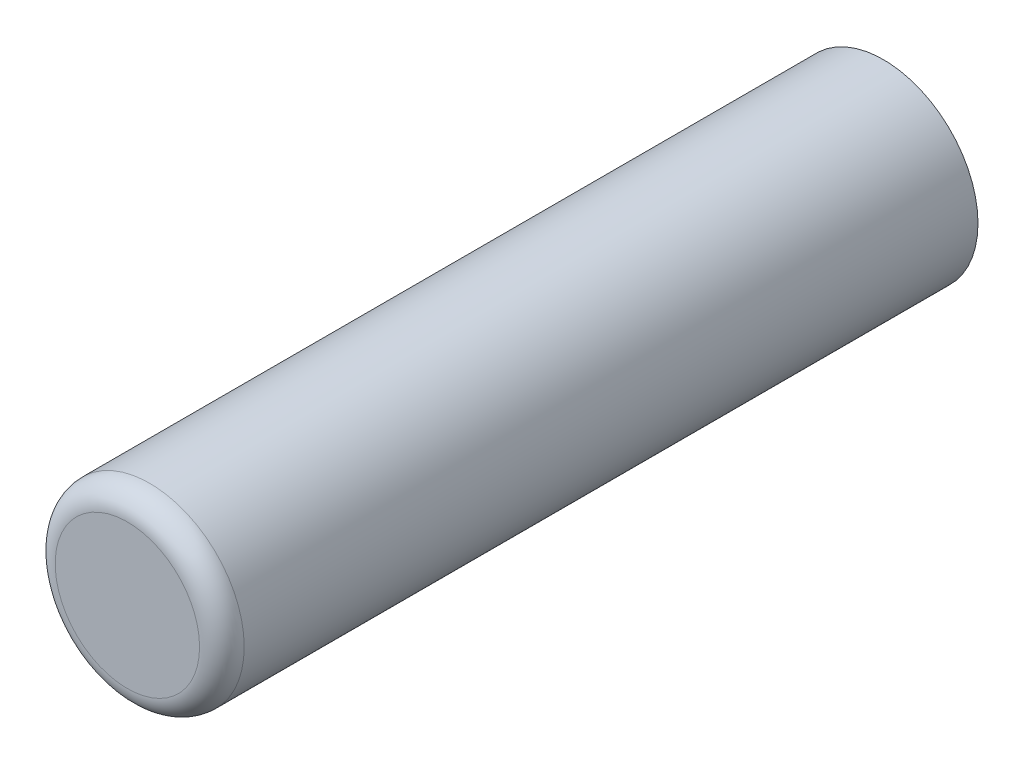
ISO-10303-21;
HEADER;
FILE_DESCRIPTION(('STEP AP214'),'2;1');
FILE_NAME('part.step','',(''),(''),'','','');
FILE_SCHEMA(('AUTOMOTIVE_DESIGN { 1 0 10303 214 1 1 1 1 }'));
ENDSEC;
DATA;
#1=APPLICATION_CONTEXT('core data for automotive mechanical design processes');
#2=APPLICATION_PROTOCOL_DEFINITION('international standard','automotive_design',2000,#1);
#3=PRODUCT_CONTEXT('',#1,'mechanical');
#4=PRODUCT('Part','Part','',(#3));
#5=PRODUCT_RELATED_PRODUCT_CATEGORY('part','',(#4));
#6=PRODUCT_DEFINITION_FORMATION('','',#4);
#7=PRODUCT_DEFINITION_CONTEXT('part definition',#1,'design');
#8=PRODUCT_DEFINITION('design','',#6,#7);
#9=PRODUCT_DEFINITION_SHAPE('','',#8);
#10=(LENGTH_UNIT() NAMED_UNIT(*) SI_UNIT(.MILLI.,.METRE.));
#11=(NAMED_UNIT(*) PLANE_ANGLE_UNIT() SI_UNIT($,.RADIAN.));
#12=(NAMED_UNIT(*) SI_UNIT($,.STERADIAN.) SOLID_ANGLE_UNIT());
#13=UNCERTAINTY_MEASURE_WITH_UNIT(LENGTH_MEASURE(1.E-05),#10,'distance_accuracy_value','');
#14=(GEOMETRIC_REPRESENTATION_CONTEXT(3) GLOBAL_UNCERTAINTY_ASSIGNED_CONTEXT((#13)) GLOBAL_UNIT_ASSIGNED_CONTEXT((#10,
#11,#12)) REPRESENTATION_CONTEXT('',''));
#15=CARTESIAN_POINT('',(0.,0.,0.));
#16=DIRECTION('',(0.,0.,1.));
#17=DIRECTION('',(1.,0.,0.));
#18=AXIS2_PLACEMENT_3D('',#15,#16,#17);
#19=CARTESIAN_POINT('',(0.,0.,25.4));
#20=DIRECTION('',(0.,0.,-1.));
#21=DIRECTION('',(-1.,0.,0.));
#22=AXIS2_PLACEMENT_3D('',#19,#20,#21);
#23=CYLINDRICAL_SURFACE('',#22,3.175);
#24=CARTESIAN_POINT('',(0.,0.,24.65));
#25=DIRECTION('',(0.,0.,1.));
#26=DIRECTION('',(1.,0.,0.));
#27=AXIS2_PLACEMENT_3D('',#24,#25,#26);
#28=CIRCLE('',#27,3.175);
#29=CARTESIAN_POINT('',(3.175,0.,24.65));
#30=VERTEX_POINT('',#29);
#31=EDGE_CURVE('E10',#30,#30,#28,.F.);
#32=ORIENTED_EDGE('',*,*,#31,.T.);
#33=EDGE_LOOP('',(#32));
#34=FACE_BOUND('',#33,.T.);
#35=CARTESIAN_POINT('',(0.,0.,0.));
#36=DIRECTION('',(0.,0.,1.));
#37=DIRECTION('',(1.,0.,0.));
#38=AXIS2_PLACEMENT_3D('',#35,#36,#37);
#39=CIRCLE('',#38,3.175);
#40=CARTESIAN_POINT('',(3.175,0.,0.));
#41=VERTEX_POINT('',#40);
#42=EDGE_CURVE('E46',#41,#41,#39,.T.);
#43=ORIENTED_EDGE('',*,*,#42,.T.);
#44=EDGE_LOOP('',(#43));
#45=FACE_BOUND('',#44,.T.);
#46=ADVANCED_FACE('F35',(#34,#45),#23,.T.);
#47=CARTESIAN_POINT('',(0.,0.,25.4));
#48=DIRECTION('',(0.,0.,1.));
#49=DIRECTION('',(1.,0.,0.));
#50=AXIS2_PLACEMENT_3D('',#47,#48,#49);
#51=PLANE('',#50);
#52=CARTESIAN_POINT('',(0.,0.,25.4));
#53=DIRECTION('',(0.,0.,1.));
#54=DIRECTION('',(1.,0.,0.));
#55=AXIS2_PLACEMENT_3D('',#52,#53,#54);
#56=CIRCLE('',#55,2.425);
#57=CARTESIAN_POINT('',(2.425,0.,25.4));
#58=VERTEX_POINT('',#57);
#59=EDGE_CURVE('E42',#58,#58,#56,.T.);
#60=ORIENTED_EDGE('',*,*,#59,.T.);
#61=EDGE_LOOP('',(#60));
#62=FACE_BOUND('',#61,.T.);
#63=ADVANCED_FACE('F56',(#62),#51,.T.);
#64=CARTESIAN_POINT('',(0.,0.,0.));
#65=DIRECTION('',(0.,0.,1.));
#66=DIRECTION('',(1.,0.,0.));
#67=AXIS2_PLACEMENT_3D('',#64,#65,#66);
#68=PLANE('',#67);
#69=ORIENTED_EDGE('',*,*,#42,.F.);
#70=EDGE_LOOP('',(#69));
#71=FACE_BOUND('',#70,.T.);
#72=ADVANCED_FACE('F54',(#71),#68,.F.);
#73=CARTESIAN_POINT('',(0.,0.,24.65));
#74=DIRECTION('',(0.,0.,1.));
#75=DIRECTION('',(1.,0.,0.));
#76=AXIS2_PLACEMENT_3D('',#73,#74,#75);
#77=TOROIDAL_SURFACE('',#76,2.425,0.75);
#78=ORIENTED_EDGE('',*,*,#31,.F.);
#79=EDGE_LOOP('',(#78));
#80=FACE_BOUND('',#79,.T.);
#81=ORIENTED_EDGE('',*,*,#59,.F.);
#82=EDGE_LOOP('',(#81));
#83=FACE_BOUND('',#82,.T.);
#84=ADVANCED_FACE('F37',(#80,#83),#77,.T.);
#85=CLOSED_SHELL('',(#46,#63,#72,#84));
#86=MANIFOLD_SOLID_BREP('B2',#85);
#87=ADVANCED_BREP_SHAPE_REPRESENTATION('',(#18,#86),#14);
#88=SHAPE_DEFINITION_REPRESENTATION(#9,#87);
ENDSEC;
END-ISO-10303-21;
